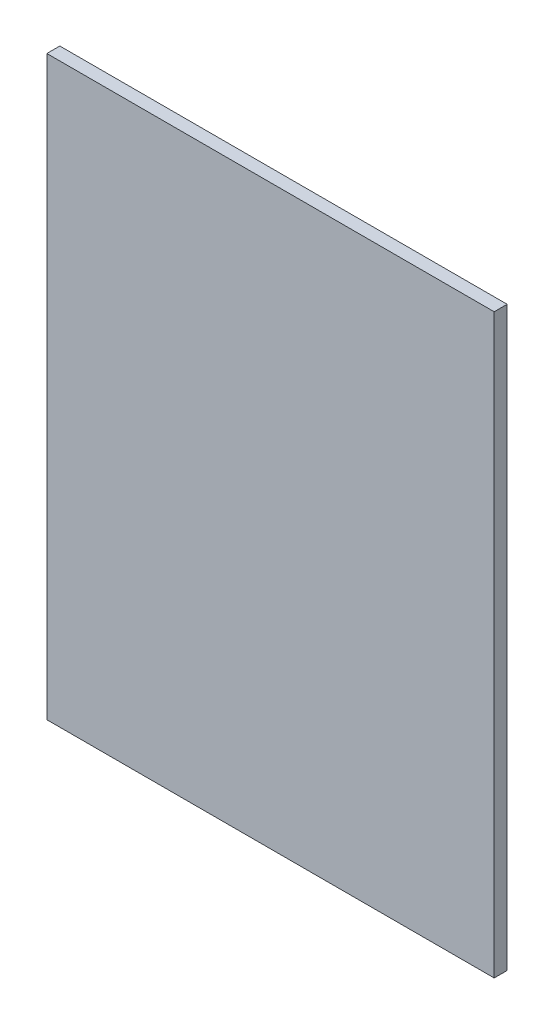
ISO-10303-21;
HEADER;
FILE_DESCRIPTION(('STEP AP214'),'2;1');
FILE_NAME('part.step','',(''),(''),'','','');
FILE_SCHEMA(('AUTOMOTIVE_DESIGN { 1 0 10303 214 1 1 1 1 }'));
ENDSEC;
DATA;
#1=APPLICATION_CONTEXT('core data for automotive mechanical design processes');
#2=APPLICATION_PROTOCOL_DEFINITION('international standard','automotive_design',2000,#1);
#3=PRODUCT_CONTEXT('',#1,'mechanical');
#4=PRODUCT('Part','Part','',(#3));
#5=PRODUCT_RELATED_PRODUCT_CATEGORY('part','',(#4));
#6=PRODUCT_DEFINITION_FORMATION('','',#4);
#7=PRODUCT_DEFINITION_CONTEXT('part definition',#1,'design');
#8=PRODUCT_DEFINITION('design','',#6,#7);
#9=PRODUCT_DEFINITION_SHAPE('','',#8);
#10=(LENGTH_UNIT() NAMED_UNIT(*) SI_UNIT(.MILLI.,.METRE.));
#11=(NAMED_UNIT(*) PLANE_ANGLE_UNIT() SI_UNIT($,.RADIAN.));
#12=(NAMED_UNIT(*) SI_UNIT($,.STERADIAN.) SOLID_ANGLE_UNIT());
#13=UNCERTAINTY_MEASURE_WITH_UNIT(LENGTH_MEASURE(1.E-05),#10,'distance_accuracy_value','');
#14=(GEOMETRIC_REPRESENTATION_CONTEXT(3) GLOBAL_UNCERTAINTY_ASSIGNED_CONTEXT((#13)) GLOBAL_UNIT_ASSIGNED_CONTEXT((#10,
#11,#12)) REPRESENTATION_CONTEXT('',''));
#15=CARTESIAN_POINT('',(0.,0.,0.));
#16=DIRECTION('',(0.,0.,1.));
#17=DIRECTION('',(1.,0.,0.));
#18=AXIS2_PLACEMENT_3D('',#15,#16,#17);
#19=CARTESIAN_POINT('',(1.725,0.,0.05));
#20=DIRECTION('',(-1.,0.,0.));
#21=DIRECTION('',(0.,0.,1.));
#22=AXIS2_PLACEMENT_3D('',#19,#20,#21);
#23=PLANE('',#22);
#24=DIRECTION('',(0.,0.,-1.));
#25=VECTOR('',#24,1.);
#26=CARTESIAN_POINT('',(1.725,-2.225,0.05));
#27=LINE('',#26,#25);
#28=CARTESIAN_POINT('',(1.725,-2.225,0.1));
#29=VERTEX_POINT('',#28);
#30=CARTESIAN_POINT('',(1.725,-2.225,0.));
#31=VERTEX_POINT('',#30);
#32=EDGE_CURVE('E89',#29,#31,#27,.T.);
#33=ORIENTED_EDGE('',*,*,#32,.T.);
#34=DIRECTION('',(0.,-1.,0.));
#35=VECTOR('',#34,1.);
#36=CARTESIAN_POINT('',(1.725,0.,0.));
#37=LINE('',#36,#35);
#38=CARTESIAN_POINT('',(1.725,2.225,0.));
#39=VERTEX_POINT('',#38);
#40=EDGE_CURVE('E85',#39,#31,#37,.T.);
#41=ORIENTED_EDGE('',*,*,#40,.F.);
#42=DIRECTION('',(0.,0.,-1.));
#43=VECTOR('',#42,1.);
#44=CARTESIAN_POINT('',(1.725,2.225,0.05));
#45=LINE('',#44,#43);
#46=CARTESIAN_POINT('',(1.725,2.225,0.1));
#47=VERTEX_POINT('',#46);
#48=EDGE_CURVE('E11',#47,#39,#45,.T.);
#49=ORIENTED_EDGE('',*,*,#48,.F.);
#50=DIRECTION('',(0.,1.,0.));
#51=VECTOR('',#50,1.);
#52=CARTESIAN_POINT('',(1.725,0.,0.1));
#53=LINE('',#52,#51);
#54=EDGE_CURVE('E115',#29,#47,#53,.T.);
#55=ORIENTED_EDGE('',*,*,#54,.F.);
#56=EDGE_LOOP('',(#33,#41,#49,#55));
#57=FACE_BOUND('',#56,.T.);
#58=ADVANCED_FACE('F17',(#57),#23,.F.);
#59=CARTESIAN_POINT('',(0.,2.225,0.05));
#60=DIRECTION('',(0.,-1.,0.));
#61=DIRECTION('',(0.,0.,-1.));
#62=AXIS2_PLACEMENT_3D('',#59,#60,#61);
#63=PLANE('',#62);
#64=ORIENTED_EDGE('',*,*,#48,.T.);
#65=DIRECTION('',(1.,0.,0.));
#66=VECTOR('',#65,1.);
#67=CARTESIAN_POINT('',(0.,2.225,0.));
#68=LINE('',#67,#66);
#69=CARTESIAN_POINT('',(-1.725,2.225,0.));
#70=VERTEX_POINT('',#69);
#71=EDGE_CURVE('E73',#70,#39,#68,.T.);
#72=ORIENTED_EDGE('',*,*,#71,.F.);
#73=DIRECTION('',(0.,0.,-1.));
#74=VECTOR('',#73,1.);
#75=CARTESIAN_POINT('',(-1.725,2.225,0.05));
#76=LINE('',#75,#74);
#77=CARTESIAN_POINT('',(-1.725,2.225,0.1));
#78=VERTEX_POINT('',#77);
#79=EDGE_CURVE('E20',#78,#70,#76,.T.);
#80=ORIENTED_EDGE('',*,*,#79,.F.);
#81=DIRECTION('',(-1.,0.,0.));
#82=VECTOR('',#81,1.);
#83=CARTESIAN_POINT('',(0.,2.225,0.1));
#84=LINE('',#83,#82);
#85=EDGE_CURVE('E76',#47,#78,#84,.T.);
#86=ORIENTED_EDGE('',*,*,#85,.F.);
#87=EDGE_LOOP('',(#64,#72,#80,#86));
#88=FACE_BOUND('',#87,.T.);
#89=ADVANCED_FACE('F72',(#88),#63,.F.);
#90=CARTESIAN_POINT('',(-1.725,0.,0.05));
#91=DIRECTION('',(1.,0.,0.));
#92=DIRECTION('',(0.,1.,0.));
#93=AXIS2_PLACEMENT_3D('',#90,#91,#92);
#94=PLANE('',#93);
#95=ORIENTED_EDGE('',*,*,#79,.T.);
#96=DIRECTION('',(0.,1.,0.));
#97=VECTOR('',#96,1.);
#98=CARTESIAN_POINT('',(-1.725,0.,0.));
#99=LINE('',#98,#97);
#100=CARTESIAN_POINT('',(-1.725,-2.225,0.));
#101=VERTEX_POINT('',#100);
#102=EDGE_CURVE('E86',#101,#70,#99,.T.);
#103=ORIENTED_EDGE('',*,*,#102,.F.);
#104=DIRECTION('',(0.,0.,-1.));
#105=VECTOR('',#104,1.);
#106=CARTESIAN_POINT('',(-1.725,-2.225,0.05));
#107=LINE('',#106,#105);
#108=CARTESIAN_POINT('',(-1.725,-2.225,0.1));
#109=VERTEX_POINT('',#108);
#110=EDGE_CURVE('E50',#109,#101,#107,.T.);
#111=ORIENTED_EDGE('',*,*,#110,.F.);
#112=DIRECTION('',(0.,-1.,0.));
#113=VECTOR('',#112,1.);
#114=CARTESIAN_POINT('',(-1.725,0.,0.1));
#115=LINE('',#114,#113);
#116=EDGE_CURVE('E101',#78,#109,#115,.T.);
#117=ORIENTED_EDGE('',*,*,#116,.F.);
#118=EDGE_LOOP('',(#95,#103,#111,#117));
#119=FACE_BOUND('',#118,.T.);
#120=ADVANCED_FACE('F127',(#119),#94,.F.);
#121=CARTESIAN_POINT('',(0.,-2.225,0.05));
#122=DIRECTION('',(0.,1.,0.));
#123=DIRECTION('',(1.,0.,0.));
#124=AXIS2_PLACEMENT_3D('',#121,#122,#123);
#125=PLANE('',#124);
#126=ORIENTED_EDGE('',*,*,#110,.T.);
#127=DIRECTION('',(-1.,0.,0.));
#128=VECTOR('',#127,1.);
#129=CARTESIAN_POINT('',(0.,-2.225,0.));
#130=LINE('',#129,#128);
#131=EDGE_CURVE('E91',#31,#101,#130,.T.);
#132=ORIENTED_EDGE('',*,*,#131,.F.);
#133=ORIENTED_EDGE('',*,*,#32,.F.);
#134=DIRECTION('',(1.,0.,0.));
#135=VECTOR('',#134,1.);
#136=CARTESIAN_POINT('',(0.,-2.225,0.1));
#137=LINE('',#136,#135);
#138=EDGE_CURVE('E92',#109,#29,#137,.T.);
#139=ORIENTED_EDGE('',*,*,#138,.F.);
#140=EDGE_LOOP('',(#126,#132,#133,#139));
#141=FACE_BOUND('',#140,.T.);
#142=ADVANCED_FACE('F128',(#141),#125,.F.);
#143=CARTESIAN_POINT('',(0.,0.,0.));
#144=DIRECTION('',(0.,0.,1.));
#145=DIRECTION('',(1.,0.,0.));
#146=AXIS2_PLACEMENT_3D('',#143,#144,#145);
#147=PLANE('',#146);
#148=ORIENTED_EDGE('',*,*,#40,.T.);
#149=ORIENTED_EDGE('',*,*,#131,.T.);
#150=ORIENTED_EDGE('',*,*,#102,.T.);
#151=ORIENTED_EDGE('',*,*,#71,.T.);
#152=EDGE_LOOP('',(#148,#149,#150,#151));
#153=FACE_BOUND('',#152,.T.);
#154=ADVANCED_FACE('F83',(#153),#147,.F.);
#155=CARTESIAN_POINT('',(0.,0.,0.1));
#156=DIRECTION('',(0.,0.,1.));
#157=DIRECTION('',(1.,0.,0.));
#158=AXIS2_PLACEMENT_3D('',#155,#156,#157);
#159=PLANE('',#158);
#160=ORIENTED_EDGE('',*,*,#54,.T.);
#161=ORIENTED_EDGE('',*,*,#85,.T.);
#162=ORIENTED_EDGE('',*,*,#116,.T.);
#163=ORIENTED_EDGE('',*,*,#138,.T.);
#164=EDGE_LOOP('',(#160,#161,#162,#163));
#165=FACE_BOUND('',#164,.T.);
#166=ADVANCED_FACE('F126',(#165),#159,.T.);
#167=CLOSED_SHELL('',(#58,#89,#120,#142,#154,#166));
#168=MANIFOLD_SOLID_BREP('B1',#167);
#169=ADVANCED_BREP_SHAPE_REPRESENTATION('',(#18,#168),#14);
#170=SHAPE_DEFINITION_REPRESENTATION(#9,#169);
ENDSEC;
END-ISO-10303-21;
